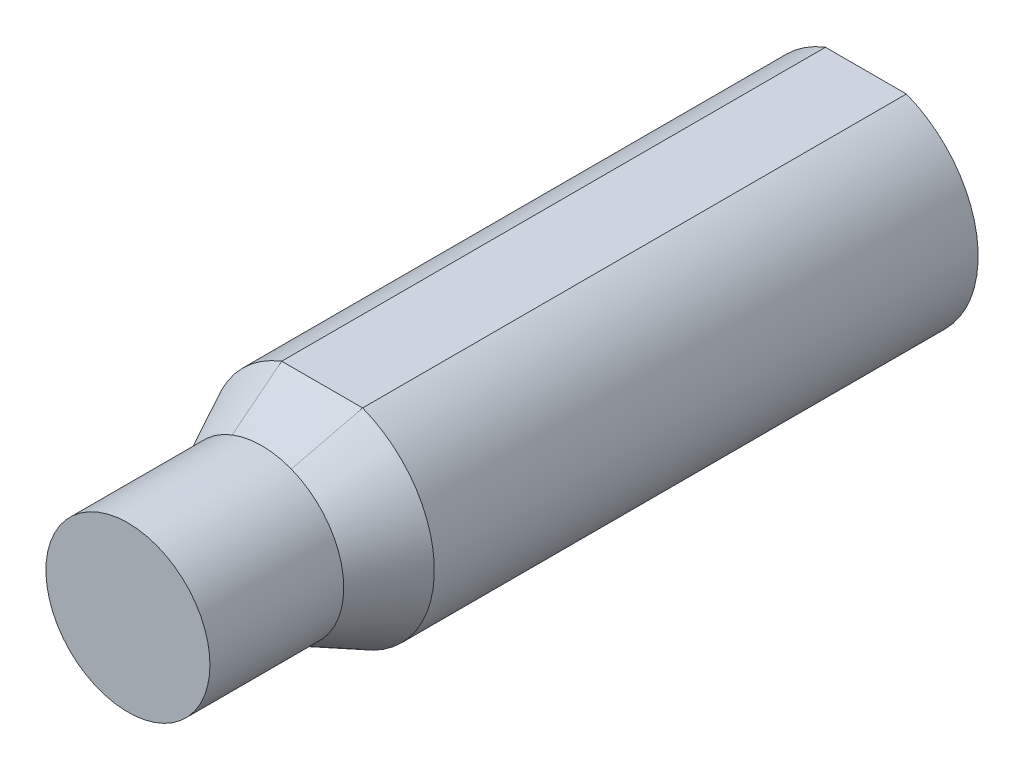
ISO-10303-21;
HEADER;
FILE_DESCRIPTION(('STEP AP214'),'2;1');
FILE_NAME('part.step','',(''),(''),'','','');
FILE_SCHEMA(('AUTOMOTIVE_DESIGN { 1 0 10303 214 1 1 1 1 }'));
ENDSEC;
DATA;
#1=APPLICATION_CONTEXT('core data for automotive mechanical design processes');
#2=APPLICATION_PROTOCOL_DEFINITION('international standard','automotive_design',2000,#1);
#3=PRODUCT_CONTEXT('',#1,'mechanical');
#4=PRODUCT('Part','Part','',(#3));
#5=PRODUCT_RELATED_PRODUCT_CATEGORY('part','',(#4));
#6=PRODUCT_DEFINITION_FORMATION('','',#4);
#7=PRODUCT_DEFINITION_CONTEXT('part definition',#1,'design');
#8=PRODUCT_DEFINITION('design','',#6,#7);
#9=PRODUCT_DEFINITION_SHAPE('','',#8);
#10=(LENGTH_UNIT() NAMED_UNIT(*) SI_UNIT(.MILLI.,.METRE.));
#11=(NAMED_UNIT(*) PLANE_ANGLE_UNIT() SI_UNIT($,.RADIAN.));
#12=(NAMED_UNIT(*) SI_UNIT($,.STERADIAN.) SOLID_ANGLE_UNIT());
#13=UNCERTAINTY_MEASURE_WITH_UNIT(LENGTH_MEASURE(1.E-05),#10,'distance_accuracy_value','');
#14=(GEOMETRIC_REPRESENTATION_CONTEXT(3) GLOBAL_UNCERTAINTY_ASSIGNED_CONTEXT((#13)) GLOBAL_UNIT_ASSIGNED_CONTEXT((#10,
#11,#12)) REPRESENTATION_CONTEXT('',''));
#15=CARTESIAN_POINT('',(0.,0.,0.));
#16=DIRECTION('',(0.,0.,1.));
#17=DIRECTION('',(1.,0.,0.));
#18=AXIS2_PLACEMENT_3D('',#15,#16,#17);
#19=CARTESIAN_POINT('',(0.,0.,12.6));
#20=DIRECTION('',(0.,0.,-1.));
#21=DIRECTION('',(-1.,0.,0.));
#22=AXIS2_PLACEMENT_3D('',#19,#20,#21);
#23=CYLINDRICAL_SURFACE('',#22,2.6);
#24=CARTESIAN_POINT('',(0.,0.,0.));
#25=DIRECTION('',(0.,0.,1.));
#26=DIRECTION('',(1.,0.,0.));
#27=AXIS2_PLACEMENT_3D('',#24,#25,#26);
#28=CIRCLE('',#27,2.6);
#29=CARTESIAN_POINT('',(-0.937749966675553,2.425,0.));
#30=VERTEX_POINT('',#29);
#31=CARTESIAN_POINT('',(-0.937749966675553,-2.425,0.));
#32=VERTEX_POINT('',#31);
#33=EDGE_CURVE('E201',#30,#32,#28,.T.);
#34=ORIENTED_EDGE('',*,*,#33,.T.);
#35=DIRECTION('',(0.,0.,-1.));
#36=VECTOR('',#35,1.);
#37=CARTESIAN_POINT('',(-0.937749966675553,-2.425,12.6));
#38=LINE('',#37,#36);
#39=CARTESIAN_POINT('',(-0.937749966675553,-2.425,12.6));
#40=VERTEX_POINT('',#39);
#41=EDGE_CURVE('E12',#40,#32,#38,.T.);
#42=ORIENTED_EDGE('',*,*,#41,.F.);
#43=CARTESIAN_POINT('',(0.,0.,12.6));
#44=DIRECTION('',(0.,0.,-1.));
#45=DIRECTION('',(-1.,0.,0.));
#46=AXIS2_PLACEMENT_3D('',#43,#44,#45);
#47=CIRCLE('',#46,2.6);
#48=CARTESIAN_POINT('',(-0.937749966675553,2.425,12.6));
#49=VERTEX_POINT('',#48);
#50=EDGE_CURVE('E126',#49,#40,#47,.F.);
#51=ORIENTED_EDGE('',*,*,#50,.F.);
#52=DIRECTION('',(0.,0.,-1.));
#53=VECTOR('',#52,1.);
#54=CARTESIAN_POINT('',(-0.937749966675553,2.425,12.6));
#55=LINE('',#54,#53);
#56=EDGE_CURVE('E128',#49,#30,#55,.T.);
#57=ORIENTED_EDGE('',*,*,#56,.T.);
#58=EDGE_LOOP('',(#34,#42,#51,#57));
#59=FACE_BOUND('',#58,.T.);
#60=ADVANCED_FACE('F59',(#59),#23,.T.);
#61=CARTESIAN_POINT('',(-0.937749966675553,-2.425,12.6));
#62=DIRECTION('',(0.,1.,0.));
#63=DIRECTION('',(0.,0.,1.));
#64=AXIS2_PLACEMENT_3D('',#61,#62,#63);
#65=PLANE('',#64);
#66=DIRECTION('',(1.,0.,0.));
#67=VECTOR('',#66,1.);
#68=CARTESIAN_POINT('',(-0.937749966675553,-2.425,0.));
#69=LINE('',#68,#67);
#70=CARTESIAN_POINT('',(0.937749966675552,-2.425,0.));
#71=VERTEX_POINT('',#70);
#72=EDGE_CURVE('E208',#32,#71,#69,.T.);
#73=ORIENTED_EDGE('',*,*,#72,.T.);
#74=DIRECTION('',(0.,0.,-1.));
#75=VECTOR('',#74,1.);
#76=CARTESIAN_POINT('',(0.937749966675552,-2.425,12.6));
#77=LINE('',#76,#75);
#78=CARTESIAN_POINT('',(0.937749966675553,-2.425,12.6));
#79=VERTEX_POINT('',#78);
#80=EDGE_CURVE('E69',#79,#71,#77,.T.);
#81=ORIENTED_EDGE('',*,*,#80,.F.);
#82=DIRECTION('',(1.,0.,0.));
#83=VECTOR('',#82,1.);
#84=CARTESIAN_POINT('',(-0.937749966675553,-2.425,12.6));
#85=LINE('',#84,#83);
#86=EDGE_CURVE('E88',#40,#79,#85,.T.);
#87=ORIENTED_EDGE('',*,*,#86,.F.);
#88=ORIENTED_EDGE('',*,*,#41,.T.);
#89=EDGE_LOOP('',(#73,#81,#87,#88));
#90=FACE_BOUND('',#89,.T.);
#91=ADVANCED_FACE('F256',(#90),#65,.F.);
#92=CARTESIAN_POINT('',(0.,0.,12.6));
#93=DIRECTION('',(0.,0.,-1.));
#94=DIRECTION('',(-1.,0.,0.));
#95=AXIS2_PLACEMENT_3D('',#92,#93,#94);
#96=CYLINDRICAL_SURFACE('',#95,2.6);
#97=CARTESIAN_POINT('',(0.,0.,0.));
#98=DIRECTION('',(0.,0.,1.));
#99=DIRECTION('',(1.,0.,0.));
#100=AXIS2_PLACEMENT_3D('',#97,#98,#99);
#101=CIRCLE('',#100,2.6);
#102=CARTESIAN_POINT('',(0.937749966675553,2.425,0.));
#103=VERTEX_POINT('',#102);
#104=EDGE_CURVE('E210',#71,#103,#101,.T.);
#105=ORIENTED_EDGE('',*,*,#104,.T.);
#106=DIRECTION('',(0.,0.,-1.));
#107=VECTOR('',#106,1.);
#108=CARTESIAN_POINT('',(0.937749966675553,2.425,12.6));
#109=LINE('',#108,#107);
#110=CARTESIAN_POINT('',(0.937749966675553,2.425,12.6));
#111=VERTEX_POINT('',#110);
#112=EDGE_CURVE('E77',#111,#103,#109,.T.);
#113=ORIENTED_EDGE('',*,*,#112,.F.);
#114=CARTESIAN_POINT('',(0.,0.,12.6));
#115=DIRECTION('',(0.,0.,-1.));
#116=DIRECTION('',(-1.,0.,0.));
#117=AXIS2_PLACEMENT_3D('',#114,#115,#116);
#118=CIRCLE('',#117,2.6);
#119=EDGE_CURVE('E142',#79,#111,#118,.F.);
#120=ORIENTED_EDGE('',*,*,#119,.F.);
#121=ORIENTED_EDGE('',*,*,#80,.T.);
#122=EDGE_LOOP('',(#105,#113,#120,#121));
#123=FACE_BOUND('',#122,.T.);
#124=ADVANCED_FACE('F260',(#123),#96,.T.);
#125=CARTESIAN_POINT('',(-0.937749966675553,2.425,12.6));
#126=DIRECTION('',(0.,-1.,0.));
#127=DIRECTION('',(0.,0.,-1.));
#128=AXIS2_PLACEMENT_3D('',#125,#126,#127);
#129=PLANE('',#128);
#130=DIRECTION('',(-1.,0.,0.));
#131=VECTOR('',#130,1.);
#132=CARTESIAN_POINT('',(-0.937749966675553,2.425,0.));
#133=LINE('',#132,#131);
#134=EDGE_CURVE('E95',#103,#30,#133,.T.);
#135=ORIENTED_EDGE('',*,*,#134,.T.);
#136=ORIENTED_EDGE('',*,*,#56,.F.);
#137=DIRECTION('',(1.,0.,0.));
#138=VECTOR('',#137,1.);
#139=CARTESIAN_POINT('',(-0.937749966675553,2.425,12.6));
#140=LINE('',#139,#138);
#141=EDGE_CURVE('E136',#111,#49,#140,.F.);
#142=ORIENTED_EDGE('',*,*,#141,.F.);
#143=ORIENTED_EDGE('',*,*,#112,.T.);
#144=EDGE_LOOP('',(#135,#136,#142,#143));
#145=FACE_BOUND('',#144,.T.);
#146=ADVANCED_FACE('F135',(#145),#129,.F.);
#147=CARTESIAN_POINT('',(0.,0.,0.));
#148=DIRECTION('',(0.,0.,1.));
#149=DIRECTION('',(1.,0.,0.));
#150=AXIS2_PLACEMENT_3D('',#147,#148,#149);
#151=PLANE('',#150);
#152=ORIENTED_EDGE('',*,*,#33,.F.);
#153=ORIENTED_EDGE('',*,*,#134,.F.);
#154=ORIENTED_EDGE('',*,*,#104,.F.);
#155=ORIENTED_EDGE('',*,*,#72,.F.);
#156=EDGE_LOOP('',(#152,#153,#154,#155));
#157=FACE_BOUND('',#156,.T.);
#158=ADVANCED_FACE('F267',(#157),#151,.F.);
#159=CARTESIAN_POINT('',(0.,0.,14.));
#160=DIRECTION('',(0.,0.,-1.));
#161=DIRECTION('',(-1.,0.,0.));
#162=AXIS2_PLACEMENT_3D('',#159,#160,#161);
#163=CONICAL_SURFACE('',#162,1.9,0.463647609000806);
#164=DIRECTION('',(0.161297897798823,-0.41711268041823,-0.894427190999916));
#165=VECTOR('',#164,1.);
#166=CARTESIAN_POINT('',(0.685278821801365,-1.77211538461538,14.));
#167=LINE('',#166,#165);
#168=CARTESIAN_POINT('',(0.685284778514239,-1.77213069595027,14.));
#169=VERTEX_POINT('',#168);
#170=EDGE_CURVE('E150',#169,#79,#167,.T.);
#171=ORIENTED_EDGE('',*,*,#170,.T.);
#172=ORIENTED_EDGE('',*,*,#119,.T.);
#173=DIRECTION('',(0.161297897798823,0.41711268041823,-0.894427190999916));
#174=VECTOR('',#173,1.);
#175=CARTESIAN_POINT('',(0.685278821801365,1.77211538461538,14.));
#176=LINE('',#175,#174);
#177=CARTESIAN_POINT('',(0.685279404169695,1.77211688631971,14.));
#178=VERTEX_POINT('',#177);
#179=EDGE_CURVE('E140',#178,#111,#176,.T.);
#180=ORIENTED_EDGE('',*,*,#179,.F.);
#181=CARTESIAN_POINT('',(0.,0.,14.));
#182=DIRECTION('',(0.,0.,1.));
#183=DIRECTION('',(1.,0.,0.));
#184=AXIS2_PLACEMENT_3D('',#181,#182,#183);
#185=CIRCLE('',#184,1.9);
#186=EDGE_CURVE('E218',#169,#178,#185,.T.);
#187=ORIENTED_EDGE('',*,*,#186,.F.);
#188=EDGE_LOOP('',(#171,#172,#180,#187));
#189=FACE_BOUND('',#188,.T.);
#190=ADVANCED_FACE('F177',(#189),#163,.T.);
#191=CARTESIAN_POINT('',(-0.685278821801366,1.77211538461538,14.));
#192=CARTESIAN_POINT('',(-0.937749966675553,2.425,12.6));
#193=CARTESIAN_POINT('',(-0.472227393228505,1.8545025887574,14.));
#194=CARTESIAN_POINT('',(-0.625166644450368,2.425,12.6));
#195=CARTESIAN_POINT('',(-0.23638141780213,1.9,14.));
#196=CARTESIAN_POINT('',(-0.312583322225183,2.425,12.6));
#197=CARTESIAN_POINT('',(0.236381417802129,1.9,14.));
#198=CARTESIAN_POINT('',(0.312583322225185,2.425,12.6));
#199=CARTESIAN_POINT('',(0.472227393228505,1.8545025887574,14.));
#200=CARTESIAN_POINT('',(0.625166644450369,2.425,12.6));
#201=CARTESIAN_POINT('',(0.685278821801366,1.77211538461538,14.));
#202=CARTESIAN_POINT('',(0.937749966675552,2.425,12.6));
#203=B_SPLINE_SURFACE_WITH_KNOTS('',3,1,((#191,#192),(#193,#194),(#195,#196),(#197,#198),(#199,
#200),(#201,#202)),.UNSPECIFIED.,.F.,.F.,.F.,(4,2,4),(2,2),(0.,0.5,1.),(0.,1.),.UNSPECIFIED.);
#204=CARTESIAN_POINT('',(-0.685284778514234,1.77213069595027,14.));
#205=VERTEX_POINT('',#204);
#206=EDGE_CURVE('E120',#178,#205,#185,.T.);
#207=DIRECTION('',(-0.161297897798823,0.41711268041823,-0.894427190999916));
#208=VECTOR('',#207,1.);
#209=CARTESIAN_POINT('',(-0.685278821801365,1.77211538461538,14.));
#210=LINE('',#209,#208);
#211=EDGE_CURVE('E139',#205,#49,#210,.T.);
#212=ORIENTED_EDGE('',*,*,#206,.F.);
#213=ORIENTED_EDGE('',*,*,#179,.T.);
#214=ORIENTED_EDGE('',*,*,#141,.T.);
#215=ORIENTED_EDGE('',*,*,#211,.F.);
#216=EDGE_LOOP('',(#212,#213,#214,#215));
#217=FACE_BOUND('',#216,.T.);
#218=ADVANCED_FACE('F138',(#217),#203,.T.);
#219=CARTESIAN_POINT('',(0.685278821801365,-1.77211538461538,14.));
#220=CARTESIAN_POINT('',(0.937749966675552,-2.425,12.6));
#221=CARTESIAN_POINT('',(0.472227393228504,-1.8545025887574,14.));
#222=CARTESIAN_POINT('',(0.625166644450367,-2.425,12.6));
#223=CARTESIAN_POINT('',(0.236381417802129,-1.9,14.));
#224=CARTESIAN_POINT('',(0.312583322225182,-2.425,12.6));
#225=CARTESIAN_POINT('',(-0.23638141780213,-1.9,14.));
#226=CARTESIAN_POINT('',(-0.312583322225186,-2.425,12.6));
#227=CARTESIAN_POINT('',(-0.472227393228505,-1.8545025887574,14.));
#228=CARTESIAN_POINT('',(-0.625166644450369,-2.425,12.6));
#229=CARTESIAN_POINT('',(-0.685278821801365,-1.77211538461538,14.));
#230=CARTESIAN_POINT('',(-0.937749966675553,-2.425,12.6));
#231=B_SPLINE_SURFACE_WITH_KNOTS('',3,1,((#219,#220),(#221,#222),(#223,#224),(#225,#226),(#227,
#228),(#229,#230)),.UNSPECIFIED.,.F.,.F.,.F.,(4,2,4),(2,2),(0.,0.5,1.),(0.,1.),.UNSPECIFIED.);
#232=CARTESIAN_POINT('',(-0.685278821801365,-1.77211538461538,14.));
#233=VERTEX_POINT('',#232);
#234=EDGE_CURVE('E221',#233,#169,#185,.T.);
#235=DIRECTION('',(-0.161297897798823,-0.41711268041823,-0.894427190999916));
#236=VECTOR('',#235,1.);
#237=CARTESIAN_POINT('',(-0.811514394238459,-2.09855769230769,13.3));
#238=LINE('',#237,#236);
#239=EDGE_CURVE('E147',#233,#40,#238,.T.);
#240=ORIENTED_EDGE('',*,*,#234,.F.);
#241=ORIENTED_EDGE('',*,*,#239,.T.);
#242=ORIENTED_EDGE('',*,*,#86,.T.);
#243=ORIENTED_EDGE('',*,*,#170,.F.);
#244=EDGE_LOOP('',(#240,#241,#242,#243));
#245=FACE_BOUND('',#244,.T.);
#246=ADVANCED_FACE('F176',(#245),#231,.T.);
#247=CARTESIAN_POINT('',(0.,0.,14.));
#248=DIRECTION('',(0.,0.,-1.));
#249=DIRECTION('',(-1.,0.,0.));
#250=AXIS2_PLACEMENT_3D('',#247,#248,#249);
#251=CONICAL_SURFACE('',#250,1.9,0.463647609000806);
#252=ORIENTED_EDGE('',*,*,#211,.T.);
#253=ORIENTED_EDGE('',*,*,#50,.T.);
#254=ORIENTED_EDGE('',*,*,#239,.F.);
#255=EDGE_CURVE('E62',#205,#233,#185,.T.);
#256=ORIENTED_EDGE('',*,*,#255,.F.);
#257=EDGE_LOOP('',(#252,#253,#254,#256));
#258=FACE_BOUND('',#257,.T.);
#259=ADVANCED_FACE('F144',(#258),#251,.T.);
#260=CARTESIAN_POINT('',(0.,0.,17.1));
#261=DIRECTION('',(0.,0.,-1.));
#262=DIRECTION('',(-1.,0.,0.));
#263=AXIS2_PLACEMENT_3D('',#260,#261,#262);
#264=CYLINDRICAL_SURFACE('',#263,1.9);
#265=ORIENTED_EDGE('',*,*,#206,.T.);
#266=ORIENTED_EDGE('',*,*,#255,.T.);
#267=ORIENTED_EDGE('',*,*,#234,.T.);
#268=ORIENTED_EDGE('',*,*,#186,.T.);
#269=EDGE_LOOP('',(#265,#266,#267,#268));
#270=FACE_BOUND('',#269,.T.);
#271=CARTESIAN_POINT('',(0.,0.,17.1));
#272=DIRECTION('',(0.,0.,1.));
#273=DIRECTION('',(1.,0.,0.));
#274=AXIS2_PLACEMENT_3D('',#271,#272,#273);
#275=CIRCLE('',#274,1.9);
#276=CARTESIAN_POINT('',(1.9,0.,17.1));
#277=VERTEX_POINT('',#276);
#278=EDGE_CURVE('E148',#277,#277,#275,.T.);
#279=ORIENTED_EDGE('',*,*,#278,.F.);
#280=EDGE_LOOP('',(#279));
#281=FACE_BOUND('',#280,.T.);
#282=ADVANCED_FACE('F235',(#270,#281),#264,.T.);
#283=CARTESIAN_POINT('',(0.,0.,17.1));
#284=DIRECTION('',(0.,0.,1.));
#285=DIRECTION('',(1.,0.,0.));
#286=AXIS2_PLACEMENT_3D('',#283,#284,#285);
#287=PLANE('',#286);
#288=ORIENTED_EDGE('',*,*,#278,.T.);
#289=EDGE_LOOP('',(#288));
#290=FACE_BOUND('',#289,.T.);
#291=ADVANCED_FACE('F250',(#290),#287,.T.);
#292=CLOSED_SHELL('',(#60,#91,#124,#146,#158,#190,#218,#246,#259,#282,#291));
#293=MANIFOLD_SOLID_BREP('B2',#292);
#294=ADVANCED_BREP_SHAPE_REPRESENTATION('',(#18,#293),#14);
#295=SHAPE_DEFINITION_REPRESENTATION(#9,#294);
ENDSEC;
END-ISO-10303-21;
